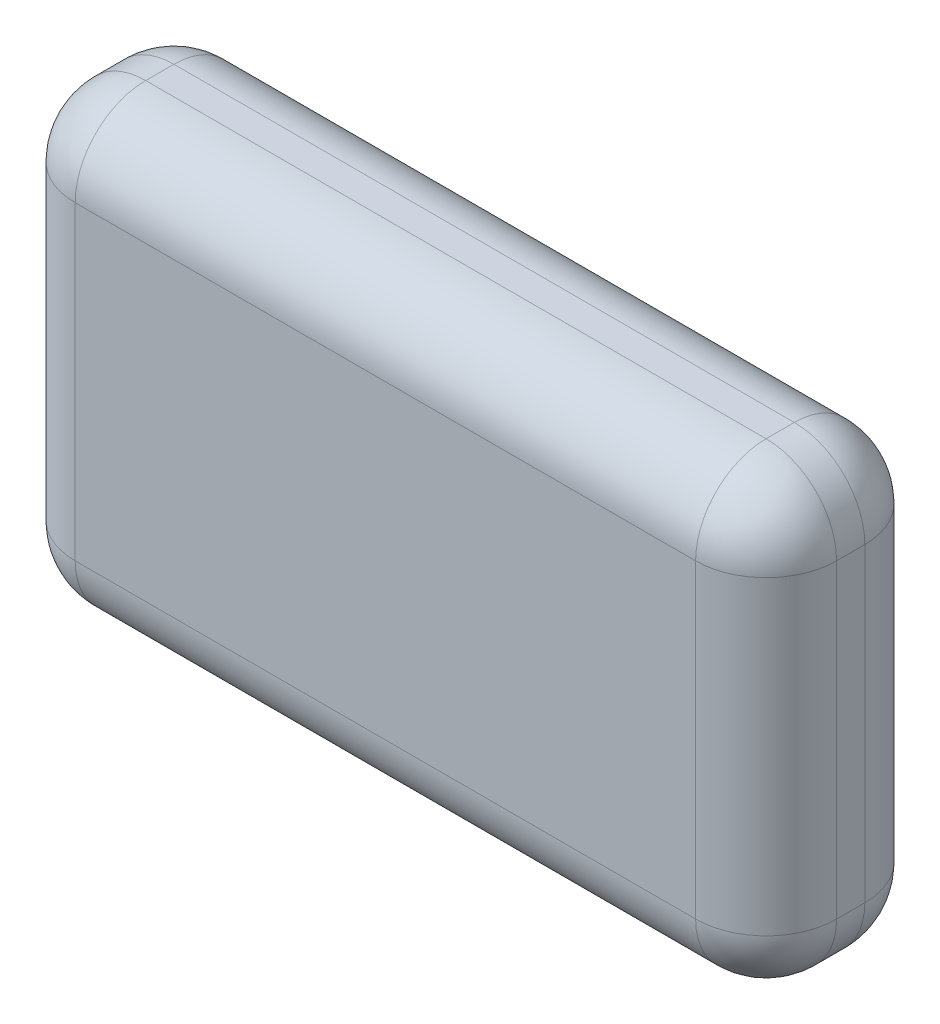
ISO-10303-21;
HEADER;
FILE_DESCRIPTION(('STEP AP214'),'2;1');
FILE_NAME('part.step','',(''),(''),'','','');
FILE_SCHEMA(('AUTOMOTIVE_DESIGN { 1 0 10303 214 1 1 1 1 }'));
ENDSEC;
DATA;
#1=APPLICATION_CONTEXT('core data for automotive mechanical design processes');
#2=APPLICATION_PROTOCOL_DEFINITION('international standard','automotive_design',2000,#1);
#3=PRODUCT_CONTEXT('',#1,'mechanical');
#4=PRODUCT('Part','Part','',(#3));
#5=PRODUCT_RELATED_PRODUCT_CATEGORY('part','',(#4));
#6=PRODUCT_DEFINITION_FORMATION('','',#4);
#7=PRODUCT_DEFINITION_CONTEXT('part definition',#1,'design');
#8=PRODUCT_DEFINITION('design','',#6,#7);
#9=PRODUCT_DEFINITION_SHAPE('','',#8);
#10=(LENGTH_UNIT() NAMED_UNIT(*) SI_UNIT(.MILLI.,.METRE.));
#11=(NAMED_UNIT(*) PLANE_ANGLE_UNIT() SI_UNIT($,.RADIAN.));
#12=(NAMED_UNIT(*) SI_UNIT($,.STERADIAN.) SOLID_ANGLE_UNIT());
#13=UNCERTAINTY_MEASURE_WITH_UNIT(LENGTH_MEASURE(1.E-05),#10,'distance_accuracy_value','');
#14=(GEOMETRIC_REPRESENTATION_CONTEXT(3) GLOBAL_UNCERTAINTY_ASSIGNED_CONTEXT((#13)) GLOBAL_UNIT_ASSIGNED_CONTEXT((#10,
#11,#12)) REPRESENTATION_CONTEXT('',''));
#15=CARTESIAN_POINT('',(0.,0.,0.));
#16=DIRECTION('',(0.,0.,1.));
#17=DIRECTION('',(1.,0.,0.));
#18=AXIS2_PLACEMENT_3D('',#15,#16,#17);
#19=CARTESIAN_POINT('',(54.,-32.,24.));
#20=DIRECTION('',(-1.,0.,0.));
#21=DIRECTION('',(0.,0.,1.));
#22=AXIS2_PLACEMENT_3D('',#19,#20,#21);
#23=PLANE('',#22);
#24=DIRECTION('',(0.,1.,0.));
#25=VECTOR('',#24,1.);
#26=CARTESIAN_POINT('',(54.,-32.,14.));
#27=LINE('',#26,#25);
#28=CARTESIAN_POINT('',(54.,22.,14.));
#29=VERTEX_POINT('',#28);
#30=CARTESIAN_POINT('',(54.,-22.,14.));
#31=VERTEX_POINT('',#30);
#32=EDGE_CURVE('E240',#29,#31,#27,.F.);
#33=ORIENTED_EDGE('',*,*,#32,.T.);
#34=DIRECTION('',(0.,0.,-1.));
#35=VECTOR('',#34,1.);
#36=CARTESIAN_POINT('',(54.,-22.,24.));
#37=LINE('',#36,#35);
#38=CARTESIAN_POINT('',(54.,-22.,10.));
#39=VERTEX_POINT('',#38);
#40=EDGE_CURVE('E242',#31,#39,#37,.T.);
#41=ORIENTED_EDGE('',*,*,#40,.T.);
#42=DIRECTION('',(0.,1.,0.));
#43=VECTOR('',#42,1.);
#44=CARTESIAN_POINT('',(54.,32.,10.));
#45=LINE('',#44,#43);
#46=CARTESIAN_POINT('',(54.,22.,10.));
#47=VERTEX_POINT('',#46);
#48=EDGE_CURVE('E238',#39,#47,#45,.T.);
#49=ORIENTED_EDGE('',*,*,#48,.T.);
#50=DIRECTION('',(0.,0.,-1.));
#51=VECTOR('',#50,1.);
#52=CARTESIAN_POINT('',(54.,22.,24.));
#53=LINE('',#52,#51);
#54=EDGE_CURVE('E236',#47,#29,#53,.F.);
#55=ORIENTED_EDGE('',*,*,#54,.T.);
#56=EDGE_LOOP('',(#33,#41,#49,#55));
#57=FACE_BOUND('',#56,.T.);
#58=ADVANCED_FACE('F33',(#57),#23,.F.);
#59=CARTESIAN_POINT('',(-54.,32.,24.));
#60=DIRECTION('',(0.,-1.,0.));
#61=DIRECTION('',(0.,0.,-1.));
#62=AXIS2_PLACEMENT_3D('',#59,#60,#61);
#63=PLANE('',#62);
#64=DIRECTION('',(-1.,0.,0.));
#65=VECTOR('',#64,1.);
#66=CARTESIAN_POINT('',(-54.,32.,14.));
#67=LINE('',#66,#65);
#68=CARTESIAN_POINT('',(-44.,32.,14.));
#69=VERTEX_POINT('',#68);
#70=CARTESIAN_POINT('',(44.,32.,14.));
#71=VERTEX_POINT('',#70);
#72=EDGE_CURVE('E42',#69,#71,#67,.F.);
#73=ORIENTED_EDGE('',*,*,#72,.T.);
#74=DIRECTION('',(0.,0.,-1.));
#75=VECTOR('',#74,1.);
#76=CARTESIAN_POINT('',(44.,32.,24.));
#77=LINE('',#76,#75);
#78=CARTESIAN_POINT('',(44.,32.,10.));
#79=VERTEX_POINT('',#78);
#80=EDGE_CURVE('E11',#71,#79,#77,.T.);
#81=ORIENTED_EDGE('',*,*,#80,.T.);
#82=DIRECTION('',(-1.,0.,0.));
#83=VECTOR('',#82,1.);
#84=CARTESIAN_POINT('',(-54.,32.,10.));
#85=LINE('',#84,#83);
#86=CARTESIAN_POINT('',(-44.,32.,10.));
#87=VERTEX_POINT('',#86);
#88=EDGE_CURVE('E245',#79,#87,#85,.T.);
#89=ORIENTED_EDGE('',*,*,#88,.T.);
#90=DIRECTION('',(0.,0.,-1.));
#91=VECTOR('',#90,1.);
#92=CARTESIAN_POINT('',(-44.,32.,24.));
#93=LINE('',#92,#91);
#94=EDGE_CURVE('E53',#87,#69,#93,.F.);
#95=ORIENTED_EDGE('',*,*,#94,.T.);
#96=EDGE_LOOP('',(#73,#81,#89,#95));
#97=FACE_BOUND('',#96,.T.);
#98=ADVANCED_FACE('F297',(#97),#63,.F.);
#99=CARTESIAN_POINT('',(-54.,-32.,24.));
#100=DIRECTION('',(1.,0.,0.));
#101=DIRECTION('',(0.,0.,-1.));
#102=AXIS2_PLACEMENT_3D('',#99,#100,#101);
#103=PLANE('',#102);
#104=DIRECTION('',(0.,0.,-1.));
#105=VECTOR('',#104,1.);
#106=CARTESIAN_POINT('',(-54.,22.,24.));
#107=LINE('',#106,#105);
#108=CARTESIAN_POINT('',(-54.,22.,14.));
#109=VERTEX_POINT('',#108);
#110=CARTESIAN_POINT('',(-54.,22.,10.));
#111=VERTEX_POINT('',#110);
#112=EDGE_CURVE('E274',#109,#111,#107,.T.);
#113=ORIENTED_EDGE('',*,*,#112,.T.);
#114=DIRECTION('',(0.,-1.,0.));
#115=VECTOR('',#114,1.);
#116=CARTESIAN_POINT('',(-54.,-32.,10.));
#117=LINE('',#116,#115);
#118=CARTESIAN_POINT('',(-54.,-22.,10.));
#119=VERTEX_POINT('',#118);
#120=EDGE_CURVE('E223',#111,#119,#117,.T.);
#121=ORIENTED_EDGE('',*,*,#120,.T.);
#122=DIRECTION('',(0.,0.,-1.));
#123=VECTOR('',#122,1.);
#124=CARTESIAN_POINT('',(-54.,-22.,24.));
#125=LINE('',#124,#123);
#126=CARTESIAN_POINT('',(-54.,-22.,14.));
#127=VERTEX_POINT('',#126);
#128=EDGE_CURVE('E277',#119,#127,#125,.F.);
#129=ORIENTED_EDGE('',*,*,#128,.T.);
#130=DIRECTION('',(0.,-1.,0.));
#131=VECTOR('',#130,1.);
#132=CARTESIAN_POINT('',(-54.,-32.,14.));
#133=LINE('',#132,#131);
#134=EDGE_CURVE('E269',#127,#109,#133,.F.);
#135=ORIENTED_EDGE('',*,*,#134,.T.);
#136=EDGE_LOOP('',(#113,#121,#129,#135));
#137=FACE_BOUND('',#136,.T.);
#138=ADVANCED_FACE('F278',(#137),#103,.F.);
#139=CARTESIAN_POINT('',(-54.,-32.,24.));
#140=DIRECTION('',(0.,1.,0.));
#141=DIRECTION('',(0.,0.,1.));
#142=AXIS2_PLACEMENT_3D('',#139,#140,#141);
#143=PLANE('',#142);
#144=DIRECTION('',(1.,0.,0.));
#145=VECTOR('',#144,1.);
#146=CARTESIAN_POINT('',(-54.,-32.,14.));
#147=LINE('',#146,#145);
#148=CARTESIAN_POINT('',(44.,-32.,14.));
#149=VERTEX_POINT('',#148);
#150=CARTESIAN_POINT('',(-44.,-32.,14.));
#151=VERTEX_POINT('',#150);
#152=EDGE_CURVE('E131',#149,#151,#147,.F.);
#153=ORIENTED_EDGE('',*,*,#152,.T.);
#154=DIRECTION('',(0.,0.,-1.));
#155=VECTOR('',#154,1.);
#156=CARTESIAN_POINT('',(-44.,-32.,24.));
#157=LINE('',#156,#155);
#158=CARTESIAN_POINT('',(-44.,-32.,10.));
#159=VERTEX_POINT('',#158);
#160=EDGE_CURVE('E127',#151,#159,#157,.T.);
#161=ORIENTED_EDGE('',*,*,#160,.T.);
#162=DIRECTION('',(1.,0.,0.));
#163=VECTOR('',#162,1.);
#164=CARTESIAN_POINT('',(54.,-32.,10.));
#165=LINE('',#164,#163);
#166=CARTESIAN_POINT('',(44.,-32.,10.));
#167=VERTEX_POINT('',#166);
#168=EDGE_CURVE('E121',#159,#167,#165,.T.);
#169=ORIENTED_EDGE('',*,*,#168,.T.);
#170=DIRECTION('',(0.,0.,-1.));
#171=VECTOR('',#170,1.);
#172=CARTESIAN_POINT('',(44.,-32.,24.));
#173=LINE('',#172,#171);
#174=EDGE_CURVE('E124',#167,#149,#173,.F.);
#175=ORIENTED_EDGE('',*,*,#174,.T.);
#176=EDGE_LOOP('',(#153,#161,#169,#175));
#177=FACE_BOUND('',#176,.T.);
#178=ADVANCED_FACE('F123',(#177),#143,.F.);
#179=CARTESIAN_POINT('',(0.,0.,24.));
#180=DIRECTION('',(0.,0.,-1.));
#181=DIRECTION('',(-1.,0.,0.));
#182=AXIS2_PLACEMENT_3D('',#179,#180,#181);
#183=PLANE('',#182);
#184=DIRECTION('',(0.,-1.,0.));
#185=VECTOR('',#184,1.);
#186=CARTESIAN_POINT('',(-44.,0.,24.));
#187=LINE('',#186,#185);
#188=CARTESIAN_POINT('',(-44.,22.,24.));
#189=VERTEX_POINT('',#188);
#190=CARTESIAN_POINT('',(-44.,-22.,24.));
#191=VERTEX_POINT('',#190);
#192=EDGE_CURVE('E219',#189,#191,#187,.T.);
#193=ORIENTED_EDGE('',*,*,#192,.T.);
#194=DIRECTION('',(1.,0.,0.));
#195=VECTOR('',#194,1.);
#196=CARTESIAN_POINT('',(0.,-22.,24.));
#197=LINE('',#196,#195);
#198=CARTESIAN_POINT('',(44.,-22.,24.));
#199=VERTEX_POINT('',#198);
#200=EDGE_CURVE('E221',#191,#199,#197,.T.);
#201=ORIENTED_EDGE('',*,*,#200,.T.);
#202=DIRECTION('',(0.,1.,0.));
#203=VECTOR('',#202,1.);
#204=CARTESIAN_POINT('',(44.,0.,24.));
#205=LINE('',#204,#203);
#206=CARTESIAN_POINT('',(44.,22.,24.));
#207=VERTEX_POINT('',#206);
#208=EDGE_CURVE('E218',#199,#207,#205,.T.);
#209=ORIENTED_EDGE('',*,*,#208,.T.);
#210=DIRECTION('',(-1.,0.,0.));
#211=VECTOR('',#210,1.);
#212=CARTESIAN_POINT('',(0.,22.,24.));
#213=LINE('',#212,#211);
#214=EDGE_CURVE('E215',#207,#189,#213,.T.);
#215=ORIENTED_EDGE('',*,*,#214,.T.);
#216=EDGE_LOOP('',(#193,#201,#209,#215));
#217=FACE_BOUND('',#216,.T.);
#218=ADVANCED_FACE('F291',(#217),#183,.F.);
#219=CARTESIAN_POINT('',(0.,0.,0.));
#220=DIRECTION('',(0.,0.,-1.));
#221=DIRECTION('',(-1.,0.,0.));
#222=AXIS2_PLACEMENT_3D('',#219,#220,#221);
#223=PLANE('',#222);
#224=DIRECTION('',(0.,1.,0.));
#225=VECTOR('',#224,1.);
#226=CARTESIAN_POINT('',(44.,-32.,0.));
#227=LINE('',#226,#225);
#228=CARTESIAN_POINT('',(44.,22.,0.));
#229=VERTEX_POINT('',#228);
#230=CARTESIAN_POINT('',(44.,-22.,0.));
#231=VERTEX_POINT('',#230);
#232=EDGE_CURVE('E233',#229,#231,#227,.F.);
#233=ORIENTED_EDGE('',*,*,#232,.T.);
#234=DIRECTION('',(1.,0.,0.));
#235=VECTOR('',#234,1.);
#236=CARTESIAN_POINT('',(-54.,-22.,0.));
#237=LINE('',#236,#235);
#238=CARTESIAN_POINT('',(-44.,-22.,0.));
#239=VERTEX_POINT('',#238);
#240=EDGE_CURVE('E154',#231,#239,#237,.F.);
#241=ORIENTED_EDGE('',*,*,#240,.T.);
#242=DIRECTION('',(0.,-1.,0.));
#243=VECTOR('',#242,1.);
#244=CARTESIAN_POINT('',(-44.,32.,0.));
#245=LINE('',#244,#243);
#246=CARTESIAN_POINT('',(-44.,22.,0.));
#247=VERTEX_POINT('',#246);
#248=EDGE_CURVE('E229',#239,#247,#245,.F.);
#249=ORIENTED_EDGE('',*,*,#248,.T.);
#250=DIRECTION('',(-1.,0.,0.));
#251=VECTOR('',#250,1.);
#252=CARTESIAN_POINT('',(54.,22.,0.));
#253=LINE('',#252,#251);
#254=EDGE_CURVE('E231',#247,#229,#253,.F.);
#255=ORIENTED_EDGE('',*,*,#254,.T.);
#256=EDGE_LOOP('',(#233,#241,#249,#255));
#257=FACE_BOUND('',#256,.T.);
#258=ADVANCED_FACE('F331',(#257),#223,.T.);
#259=CARTESIAN_POINT('',(44.,22.,24.));
#260=DIRECTION('',(0.,0.,-1.));
#261=DIRECTION('',(-1.,0.,0.));
#262=AXIS2_PLACEMENT_3D('',#259,#260,#261);
#263=CYLINDRICAL_SURFACE('',#262,10.);
#264=CARTESIAN_POINT('',(44.,22.,14.));
#265=DIRECTION('',(0.,0.,1.));
#266=DIRECTION('',(1.,0.,0.));
#267=AXIS2_PLACEMENT_3D('',#264,#265,#266);
#268=CIRCLE('',#267,10.);
#269=EDGE_CURVE('E37',#29,#71,#268,.T.);
#270=ORIENTED_EDGE('',*,*,#269,.F.);
#271=ORIENTED_EDGE('',*,*,#54,.F.);
#272=CARTESIAN_POINT('',(44.,22.,10.));
#273=DIRECTION('',(0.,0.,-1.));
#274=DIRECTION('',(-1.,0.,0.));
#275=AXIS2_PLACEMENT_3D('',#272,#273,#274);
#276=CIRCLE('',#275,10.);
#277=EDGE_CURVE('E195',#79,#47,#276,.T.);
#278=ORIENTED_EDGE('',*,*,#277,.F.);
#279=ORIENTED_EDGE('',*,*,#80,.F.);
#280=EDGE_LOOP('',(#270,#271,#278,#279));
#281=FACE_BOUND('',#280,.T.);
#282=ADVANCED_FACE('F35',(#281),#263,.T.);
#283=CARTESIAN_POINT('',(44.,22.,14.));
#284=DIRECTION('',(0.,0.,1.));
#285=DIRECTION('',(1.,0.,0.));
#286=AXIS2_PLACEMENT_3D('',#283,#284,#285);
#287=SPHERICAL_SURFACE('',#286,10.);
#288=CARTESIAN_POINT('',(44.,22.,14.));
#289=DIRECTION('',(0.,1.,0.));
#290=DIRECTION('',(0.,0.,1.));
#291=AXIS2_PLACEMENT_3D('',#288,#289,#290);
#292=CIRCLE('',#291,10.);
#293=EDGE_CURVE('E190',#29,#207,#292,.F.);
#294=ORIENTED_EDGE('',*,*,#293,.F.);
#295=ORIENTED_EDGE('',*,*,#269,.T.);
#296=CARTESIAN_POINT('',(44.,22.,14.));
#297=DIRECTION('',(1.,0.,0.));
#298=DIRECTION('',(0.,0.,-1.));
#299=AXIS2_PLACEMENT_3D('',#296,#297,#298);
#300=CIRCLE('',#299,10.);
#301=EDGE_CURVE('E193',#207,#71,#300,.F.);
#302=ORIENTED_EDGE('',*,*,#301,.F.);
#303=EDGE_LOOP('',(#294,#295,#302));
#304=FACE_BOUND('',#303,.T.);
#305=ADVANCED_FACE('F206',(#304),#287,.T.);
#306=CARTESIAN_POINT('',(44.,22.,10.));
#307=DIRECTION('',(0.,0.,1.));
#308=DIRECTION('',(1.,0.,0.));
#309=AXIS2_PLACEMENT_3D('',#306,#307,#308);
#310=SPHERICAL_SURFACE('',#309,10.);
#311=CARTESIAN_POINT('',(44.,22.,10.));
#312=DIRECTION('',(1.,0.,0.));
#313=DIRECTION('',(0.,1.,0.));
#314=AXIS2_PLACEMENT_3D('',#311,#312,#313);
#315=CIRCLE('',#314,10.);
#316=EDGE_CURVE('E184',#79,#229,#315,.F.);
#317=ORIENTED_EDGE('',*,*,#316,.F.);
#318=ORIENTED_EDGE('',*,*,#277,.T.);
#319=CARTESIAN_POINT('',(44.,22.,10.));
#320=DIRECTION('',(0.,1.,0.));
#321=DIRECTION('',(0.,0.,1.));
#322=AXIS2_PLACEMENT_3D('',#319,#320,#321);
#323=CIRCLE('',#322,10.);
#324=EDGE_CURVE('E187',#229,#47,#323,.F.);
#325=ORIENTED_EDGE('',*,*,#324,.F.);
#326=EDGE_LOOP('',(#317,#318,#325));
#327=FACE_BOUND('',#326,.T.);
#328=ADVANCED_FACE('F355',(#327),#310,.T.);
#329=CARTESIAN_POINT('',(0.,22.,14.));
#330=DIRECTION('',(-1.,0.,0.));
#331=DIRECTION('',(0.,0.,1.));
#332=AXIS2_PLACEMENT_3D('',#329,#330,#331);
#333=CYLINDRICAL_SURFACE('',#332,10.);
#334=ORIENTED_EDGE('',*,*,#301,.T.);
#335=ORIENTED_EDGE('',*,*,#72,.F.);
#336=CARTESIAN_POINT('',(-44.,22.,14.));
#337=DIRECTION('',(-1.,0.,0.));
#338=DIRECTION('',(0.,0.,1.));
#339=AXIS2_PLACEMENT_3D('',#336,#337,#338);
#340=CIRCLE('',#339,10.);
#341=EDGE_CURVE('E178',#189,#69,#340,.T.);
#342=ORIENTED_EDGE('',*,*,#341,.F.);
#343=ORIENTED_EDGE('',*,*,#214,.F.);
#344=EDGE_LOOP('',(#334,#335,#342,#343));
#345=FACE_BOUND('',#344,.T.);
#346=ADVANCED_FACE('F212',(#345),#333,.T.);
#347=CARTESIAN_POINT('',(44.,0.,14.));
#348=DIRECTION('',(0.,1.,0.));
#349=DIRECTION('',(0.,0.,1.));
#350=AXIS2_PLACEMENT_3D('',#347,#348,#349);
#351=CYLINDRICAL_SURFACE('',#350,10.);
#352=ORIENTED_EDGE('',*,*,#293,.T.);
#353=ORIENTED_EDGE('',*,*,#208,.F.);
#354=CARTESIAN_POINT('',(44.,-22.,14.));
#355=DIRECTION('',(0.,-1.,0.));
#356=DIRECTION('',(0.,0.,-1.));
#357=AXIS2_PLACEMENT_3D('',#354,#355,#356);
#358=CIRCLE('',#357,10.);
#359=EDGE_CURVE('E175',#31,#199,#358,.T.);
#360=ORIENTED_EDGE('',*,*,#359,.F.);
#361=ORIENTED_EDGE('',*,*,#32,.F.);
#362=EDGE_LOOP('',(#352,#353,#360,#361));
#363=FACE_BOUND('',#362,.T.);
#364=ADVANCED_FACE('F295',(#363),#351,.T.);
#365=CARTESIAN_POINT('',(44.,-22.,24.));
#366=DIRECTION('',(0.,0.,-1.));
#367=DIRECTION('',(-1.,0.,0.));
#368=AXIS2_PLACEMENT_3D('',#365,#366,#367);
#369=CYLINDRICAL_SURFACE('',#368,10.);
#370=CARTESIAN_POINT('',(44.,-22.,10.));
#371=DIRECTION('',(0.,0.,-1.));
#372=DIRECTION('',(-1.,0.,0.));
#373=AXIS2_PLACEMENT_3D('',#370,#371,#372);
#374=CIRCLE('',#373,10.);
#375=EDGE_CURVE('E138',#39,#167,#374,.T.);
#376=ORIENTED_EDGE('',*,*,#375,.F.);
#377=ORIENTED_EDGE('',*,*,#40,.F.);
#378=CARTESIAN_POINT('',(44.,-22.,14.));
#379=DIRECTION('',(0.,0.,1.));
#380=DIRECTION('',(1.,0.,0.));
#381=AXIS2_PLACEMENT_3D('',#378,#379,#380);
#382=CIRCLE('',#381,10.);
#383=EDGE_CURVE('E141',#149,#31,#382,.T.);
#384=ORIENTED_EDGE('',*,*,#383,.F.);
#385=ORIENTED_EDGE('',*,*,#174,.F.);
#386=EDGE_LOOP('',(#376,#377,#384,#385));
#387=FACE_BOUND('',#386,.T.);
#388=ADVANCED_FACE('F136',(#387),#369,.T.);
#389=CARTESIAN_POINT('',(44.,-32.,10.));
#390=DIRECTION('',(0.,-1.,0.));
#391=DIRECTION('',(0.,0.,-1.));
#392=AXIS2_PLACEMENT_3D('',#389,#390,#391);
#393=CYLINDRICAL_SURFACE('',#392,10.);
#394=ORIENTED_EDGE('',*,*,#324,.T.);
#395=ORIENTED_EDGE('',*,*,#48,.F.);
#396=CARTESIAN_POINT('',(44.,-22.,10.));
#397=DIRECTION('',(0.,-1.,0.));
#398=DIRECTION('',(0.,0.,-1.));
#399=AXIS2_PLACEMENT_3D('',#396,#397,#398);
#400=CIRCLE('',#399,10.);
#401=EDGE_CURVE('E150',#231,#39,#400,.T.);
#402=ORIENTED_EDGE('',*,*,#401,.F.);
#403=ORIENTED_EDGE('',*,*,#232,.F.);
#404=EDGE_LOOP('',(#394,#395,#402,#403));
#405=FACE_BOUND('',#404,.T.);
#406=ADVANCED_FACE('F379',(#405),#393,.T.);
#407=CARTESIAN_POINT('',(-54.,22.,10.));
#408=DIRECTION('',(1.,0.,0.));
#409=DIRECTION('',(0.,0.,-1.));
#410=AXIS2_PLACEMENT_3D('',#407,#408,#409);
#411=CYLINDRICAL_SURFACE('',#410,10.);
#412=ORIENTED_EDGE('',*,*,#316,.T.);
#413=ORIENTED_EDGE('',*,*,#254,.F.);
#414=CARTESIAN_POINT('',(-44.,22.,10.));
#415=DIRECTION('',(-1.,0.,0.));
#416=DIRECTION('',(0.,0.,1.));
#417=AXIS2_PLACEMENT_3D('',#414,#415,#416);
#418=CIRCLE('',#417,10.);
#419=EDGE_CURVE('E170',#87,#247,#418,.T.);
#420=ORIENTED_EDGE('',*,*,#419,.F.);
#421=ORIENTED_EDGE('',*,*,#88,.F.);
#422=EDGE_LOOP('',(#412,#413,#420,#421));
#423=FACE_BOUND('',#422,.T.);
#424=ADVANCED_FACE('F305',(#423),#411,.T.);
#425=CARTESIAN_POINT('',(-44.,22.,24.));
#426=DIRECTION('',(0.,0.,-1.));
#427=DIRECTION('',(-1.,0.,0.));
#428=AXIS2_PLACEMENT_3D('',#425,#426,#427);
#429=CYLINDRICAL_SURFACE('',#428,10.);
#430=CARTESIAN_POINT('',(-44.,22.,14.));
#431=DIRECTION('',(0.,0.,1.));
#432=DIRECTION('',(1.,0.,0.));
#433=AXIS2_PLACEMENT_3D('',#430,#431,#432);
#434=CIRCLE('',#433,10.);
#435=EDGE_CURVE('E181',#69,#109,#434,.T.);
#436=ORIENTED_EDGE('',*,*,#435,.F.);
#437=ORIENTED_EDGE('',*,*,#94,.F.);
#438=CARTESIAN_POINT('',(-44.,22.,10.));
#439=DIRECTION('',(0.,0.,-1.));
#440=DIRECTION('',(-1.,0.,0.));
#441=AXIS2_PLACEMENT_3D('',#438,#439,#440);
#442=CIRCLE('',#441,10.);
#443=EDGE_CURVE('E167',#111,#87,#442,.T.);
#444=ORIENTED_EDGE('',*,*,#443,.F.);
#445=ORIENTED_EDGE('',*,*,#112,.F.);
#446=EDGE_LOOP('',(#436,#437,#444,#445));
#447=FACE_BOUND('',#446,.T.);
#448=ADVANCED_FACE('F302',(#447),#429,.T.);
#449=CARTESIAN_POINT('',(-44.,22.,14.));
#450=DIRECTION('',(0.,0.,1.));
#451=DIRECTION('',(1.,0.,0.));
#452=AXIS2_PLACEMENT_3D('',#449,#450,#451);
#453=SPHERICAL_SURFACE('',#452,10.);
#454=ORIENTED_EDGE('',*,*,#341,.T.);
#455=ORIENTED_EDGE('',*,*,#435,.T.);
#456=CARTESIAN_POINT('',(-44.,22.,14.));
#457=DIRECTION('',(0.,1.,0.));
#458=DIRECTION('',(0.,0.,1.));
#459=AXIS2_PLACEMENT_3D('',#456,#457,#458);
#460=CIRCLE('',#459,10.);
#461=EDGE_CURVE('E158',#189,#109,#460,.F.);
#462=ORIENTED_EDGE('',*,*,#461,.F.);
#463=EDGE_LOOP('',(#454,#455,#462));
#464=FACE_BOUND('',#463,.T.);
#465=ADVANCED_FACE('F399',(#464),#453,.T.);
#466=CARTESIAN_POINT('',(44.,-22.,14.));
#467=DIRECTION('',(0.,0.,1.));
#468=DIRECTION('',(1.,0.,0.));
#469=AXIS2_PLACEMENT_3D('',#466,#467,#468);
#470=SPHERICAL_SURFACE('',#469,10.);
#471=ORIENTED_EDGE('',*,*,#383,.T.);
#472=ORIENTED_EDGE('',*,*,#359,.T.);
#473=CARTESIAN_POINT('',(44.,-22.,14.));
#474=DIRECTION('',(1.,0.,0.));
#475=DIRECTION('',(0.,0.,-1.));
#476=AXIS2_PLACEMENT_3D('',#473,#474,#475);
#477=CIRCLE('',#476,10.);
#478=EDGE_CURVE('E155',#149,#199,#477,.F.);
#479=ORIENTED_EDGE('',*,*,#478,.F.);
#480=EDGE_LOOP('',(#471,#472,#479));
#481=FACE_BOUND('',#480,.T.);
#482=ADVANCED_FACE('F406',(#481),#470,.T.);
#483=CARTESIAN_POINT('',(44.,-22.,10.));
#484=DIRECTION('',(0.,0.,1.));
#485=DIRECTION('',(1.,0.,0.));
#486=AXIS2_PLACEMENT_3D('',#483,#484,#485);
#487=SPHERICAL_SURFACE('',#486,10.);
#488=ORIENTED_EDGE('',*,*,#401,.T.);
#489=ORIENTED_EDGE('',*,*,#375,.T.);
#490=CARTESIAN_POINT('',(44.,-22.,10.));
#491=DIRECTION('',(1.,0.,0.));
#492=DIRECTION('',(0.,0.,-1.));
#493=AXIS2_PLACEMENT_3D('',#490,#491,#492);
#494=CIRCLE('',#493,10.);
#495=EDGE_CURVE('E147',#231,#167,#494,.F.);
#496=ORIENTED_EDGE('',*,*,#495,.F.);
#497=EDGE_LOOP('',(#488,#489,#496));
#498=FACE_BOUND('',#497,.T.);
#499=ADVANCED_FACE('F146',(#498),#487,.T.);
#500=CARTESIAN_POINT('',(-44.,22.,10.));
#501=DIRECTION('',(0.,0.,1.));
#502=DIRECTION('',(1.,0.,0.));
#503=AXIS2_PLACEMENT_3D('',#500,#501,#502);
#504=SPHERICAL_SURFACE('',#503,10.);
#505=ORIENTED_EDGE('',*,*,#443,.T.);
#506=ORIENTED_EDGE('',*,*,#419,.T.);
#507=CARTESIAN_POINT('',(-44.,22.,10.));
#508=DIRECTION('',(0.,1.,0.));
#509=DIRECTION('',(0.,0.,1.));
#510=AXIS2_PLACEMENT_3D('',#507,#508,#509);
#511=CIRCLE('',#510,10.);
#512=EDGE_CURVE('E156',#111,#247,#511,.F.);
#513=ORIENTED_EDGE('',*,*,#512,.F.);
#514=EDGE_LOOP('',(#505,#506,#513));
#515=FACE_BOUND('',#514,.T.);
#516=ADVANCED_FACE('F307',(#515),#504,.T.);
#517=CARTESIAN_POINT('',(-44.,0.,14.));
#518=DIRECTION('',(0.,-1.,0.));
#519=DIRECTION('',(0.,0.,-1.));
#520=AXIS2_PLACEMENT_3D('',#517,#518,#519);
#521=CYLINDRICAL_SURFACE('',#520,10.);
#522=ORIENTED_EDGE('',*,*,#461,.T.);
#523=ORIENTED_EDGE('',*,*,#134,.F.);
#524=CARTESIAN_POINT('',(-44.,-22.,14.));
#525=DIRECTION('',(0.,-1.,0.));
#526=DIRECTION('',(0.,0.,-1.));
#527=AXIS2_PLACEMENT_3D('',#524,#525,#526);
#528=CIRCLE('',#527,10.);
#529=EDGE_CURVE('E161',#191,#127,#528,.T.);
#530=ORIENTED_EDGE('',*,*,#529,.F.);
#531=ORIENTED_EDGE('',*,*,#192,.F.);
#532=EDGE_LOOP('',(#522,#523,#530,#531));
#533=FACE_BOUND('',#532,.T.);
#534=ADVANCED_FACE('F271',(#533),#521,.T.);
#535=CARTESIAN_POINT('',(0.,-22.,14.));
#536=DIRECTION('',(1.,0.,0.));
#537=DIRECTION('',(0.,0.,-1.));
#538=AXIS2_PLACEMENT_3D('',#535,#536,#537);
#539=CYLINDRICAL_SURFACE('',#538,10.);
#540=ORIENTED_EDGE('',*,*,#478,.T.);
#541=ORIENTED_EDGE('',*,*,#200,.F.);
#542=CARTESIAN_POINT('',(-44.,-22.,14.));
#543=DIRECTION('',(-1.,0.,0.));
#544=DIRECTION('',(0.,0.,1.));
#545=AXIS2_PLACEMENT_3D('',#542,#543,#544);
#546=CIRCLE('',#545,10.);
#547=EDGE_CURVE('E258',#151,#191,#546,.T.);
#548=ORIENTED_EDGE('',*,*,#547,.F.);
#549=ORIENTED_EDGE('',*,*,#152,.F.);
#550=EDGE_LOOP('',(#540,#541,#548,#549));
#551=FACE_BOUND('',#550,.T.);
#552=ADVANCED_FACE('F290',(#551),#539,.T.);
#553=CARTESIAN_POINT('',(-54.,-22.,10.));
#554=DIRECTION('',(-1.,0.,0.));
#555=DIRECTION('',(0.,0.,1.));
#556=AXIS2_PLACEMENT_3D('',#553,#554,#555);
#557=CYLINDRICAL_SURFACE('',#556,10.);
#558=ORIENTED_EDGE('',*,*,#495,.T.);
#559=ORIENTED_EDGE('',*,*,#168,.F.);
#560=CARTESIAN_POINT('',(-44.,-22.,10.));
#561=DIRECTION('',(-1.,0.,0.));
#562=DIRECTION('',(0.,0.,1.));
#563=AXIS2_PLACEMENT_3D('',#560,#561,#562);
#564=CIRCLE('',#563,10.);
#565=EDGE_CURVE('E255',#239,#159,#564,.T.);
#566=ORIENTED_EDGE('',*,*,#565,.F.);
#567=ORIENTED_EDGE('',*,*,#240,.F.);
#568=EDGE_LOOP('',(#558,#559,#566,#567));
#569=FACE_BOUND('',#568,.T.);
#570=ADVANCED_FACE('F152',(#569),#557,.T.);
#571=CARTESIAN_POINT('',(-44.,-32.,10.));
#572=DIRECTION('',(0.,1.,0.));
#573=DIRECTION('',(0.,0.,1.));
#574=AXIS2_PLACEMENT_3D('',#571,#572,#573);
#575=CYLINDRICAL_SURFACE('',#574,10.);
#576=ORIENTED_EDGE('',*,*,#512,.T.);
#577=ORIENTED_EDGE('',*,*,#248,.F.);
#578=CARTESIAN_POINT('',(-44.,-22.,10.));
#579=DIRECTION('',(0.,-1.,0.));
#580=DIRECTION('',(0.,0.,-1.));
#581=AXIS2_PLACEMENT_3D('',#578,#579,#580);
#582=CIRCLE('',#581,10.);
#583=EDGE_CURVE('E253',#119,#239,#582,.T.);
#584=ORIENTED_EDGE('',*,*,#583,.F.);
#585=ORIENTED_EDGE('',*,*,#120,.F.);
#586=EDGE_LOOP('',(#576,#577,#584,#585));
#587=FACE_BOUND('',#586,.T.);
#588=ADVANCED_FACE('F310',(#587),#575,.T.);
#589=CARTESIAN_POINT('',(-44.,-22.,14.));
#590=DIRECTION('',(0.,0.,1.));
#591=DIRECTION('',(1.,0.,0.));
#592=AXIS2_PLACEMENT_3D('',#589,#590,#591);
#593=SPHERICAL_SURFACE('',#592,10.);
#594=ORIENTED_EDGE('',*,*,#547,.T.);
#595=ORIENTED_EDGE('',*,*,#529,.T.);
#596=CARTESIAN_POINT('',(-44.,-22.,14.));
#597=DIRECTION('',(0.,0.,1.));
#598=DIRECTION('',(1.,0.,0.));
#599=AXIS2_PLACEMENT_3D('',#596,#597,#598);
#600=CIRCLE('',#599,10.);
#601=EDGE_CURVE('E251',#151,#127,#600,.F.);
#602=ORIENTED_EDGE('',*,*,#601,.F.);
#603=EDGE_LOOP('',(#594,#595,#602));
#604=FACE_BOUND('',#603,.T.);
#605=ADVANCED_FACE('F265',(#604),#593,.T.);
#606=CARTESIAN_POINT('',(-44.,-22.,10.));
#607=DIRECTION('',(0.,0.,1.));
#608=DIRECTION('',(1.,0.,0.));
#609=AXIS2_PLACEMENT_3D('',#606,#607,#608);
#610=SPHERICAL_SURFACE('',#609,10.);
#611=ORIENTED_EDGE('',*,*,#583,.T.);
#612=ORIENTED_EDGE('',*,*,#565,.T.);
#613=CARTESIAN_POINT('',(-44.,-22.,10.));
#614=DIRECTION('',(0.,0.,-1.));
#615=DIRECTION('',(-1.,0.,0.));
#616=AXIS2_PLACEMENT_3D('',#613,#614,#615);
#617=CIRCLE('',#616,10.);
#618=EDGE_CURVE('E249',#119,#159,#617,.F.);
#619=ORIENTED_EDGE('',*,*,#618,.F.);
#620=EDGE_LOOP('',(#611,#612,#619));
#621=FACE_BOUND('',#620,.T.);
#622=ADVANCED_FACE('F312',(#621),#610,.T.);
#623=CARTESIAN_POINT('',(-44.,-22.,24.));
#624=DIRECTION('',(0.,0.,-1.));
#625=DIRECTION('',(-1.,0.,0.));
#626=AXIS2_PLACEMENT_3D('',#623,#624,#625);
#627=CYLINDRICAL_SURFACE('',#626,10.);
#628=ORIENTED_EDGE('',*,*,#601,.T.);
#629=ORIENTED_EDGE('',*,*,#128,.F.);
#630=ORIENTED_EDGE('',*,*,#618,.T.);
#631=ORIENTED_EDGE('',*,*,#160,.F.);
#632=EDGE_LOOP('',(#628,#629,#630,#631));
#633=FACE_BOUND('',#632,.T.);
#634=ADVANCED_FACE('F313',(#633),#627,.T.);
#635=CLOSED_SHELL('',(#58,#98,#138,#178,#218,#258,#282,#305,#328,#346,#364,#388,#406,#424,#448,
#465,#482,#499,#516,#534,#552,#570,#588,#605,#622,#634));
#636=MANIFOLD_SOLID_BREP('B2',#635);
#637=ADVANCED_BREP_SHAPE_REPRESENTATION('',(#18,#636),#14);
#638=SHAPE_DEFINITION_REPRESENTATION(#9,#637);
ENDSEC;
END-ISO-10303-21;
